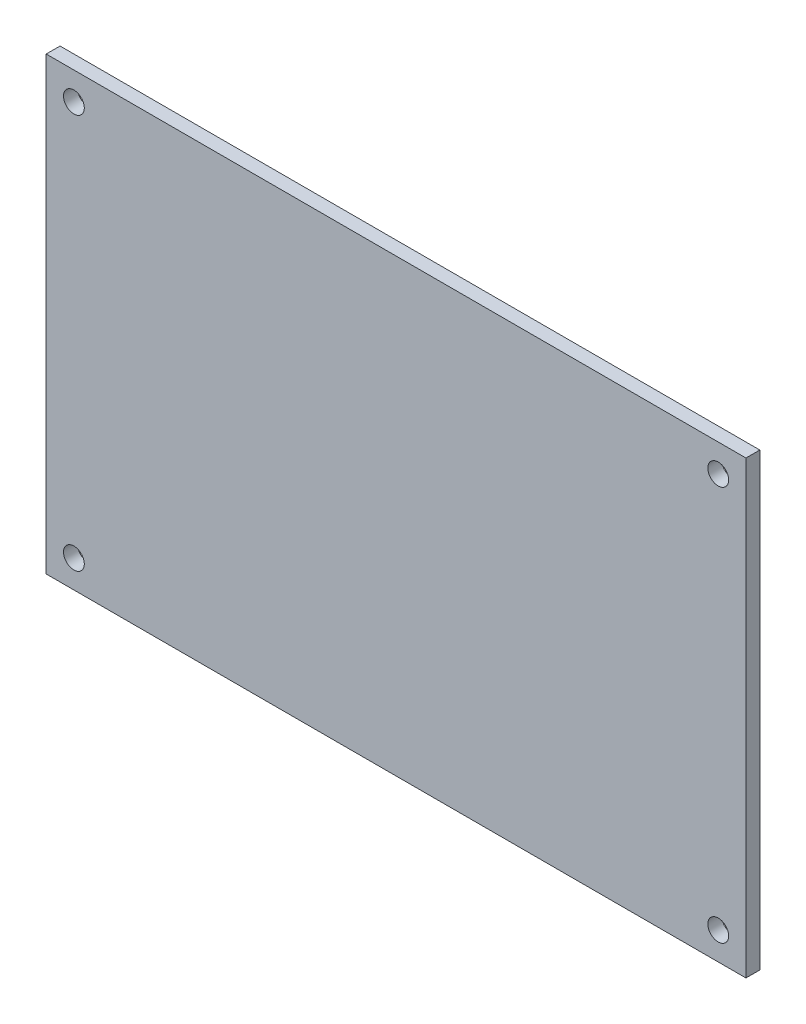
ISO-10303-21;
HEADER;
FILE_DESCRIPTION(('STEP AP214'),'2;1');
FILE_NAME('part.step','',(''),(''),'','','');
FILE_SCHEMA(('AUTOMOTIVE_DESIGN { 1 0 10303 214 1 1 1 1 }'));
ENDSEC;
DATA;
#1=APPLICATION_CONTEXT('core data for automotive mechanical design processes');
#2=APPLICATION_PROTOCOL_DEFINITION('international standard','automotive_design',2000,#1);
#3=PRODUCT_CONTEXT('',#1,'mechanical');
#4=PRODUCT('Part','Part','',(#3));
#5=PRODUCT_RELATED_PRODUCT_CATEGORY('part','',(#4));
#6=PRODUCT_DEFINITION_FORMATION('','',#4);
#7=PRODUCT_DEFINITION_CONTEXT('part definition',#1,'design');
#8=PRODUCT_DEFINITION('design','',#6,#7);
#9=PRODUCT_DEFINITION_SHAPE('','',#8);
#10=(LENGTH_UNIT() NAMED_UNIT(*) SI_UNIT(.MILLI.,.METRE.));
#11=(NAMED_UNIT(*) PLANE_ANGLE_UNIT() SI_UNIT($,.RADIAN.));
#12=(NAMED_UNIT(*) SI_UNIT($,.STERADIAN.) SOLID_ANGLE_UNIT());
#13=UNCERTAINTY_MEASURE_WITH_UNIT(LENGTH_MEASURE(1.E-05),#10,'distance_accuracy_value','');
#14=(GEOMETRIC_REPRESENTATION_CONTEXT(3) GLOBAL_UNCERTAINTY_ASSIGNED_CONTEXT((#13)) GLOBAL_UNIT_ASSIGNED_CONTEXT((#10,
#11,#12)) REPRESENTATION_CONTEXT('',''));
#15=CARTESIAN_POINT('',(0.,0.,0.));
#16=DIRECTION('',(0.,0.,1.));
#17=DIRECTION('',(1.,0.,0.));
#18=AXIS2_PLACEMENT_3D('',#15,#16,#17);
#19=CARTESIAN_POINT('',(0.,0.,2.));
#20=DIRECTION('',(1.,0.,0.));
#21=DIRECTION('',(0.,0.,-1.));
#22=AXIS2_PLACEMENT_3D('',#19,#20,#21);
#23=PLANE('',#22);
#24=DIRECTION('',(0.,-1.,0.));
#25=VECTOR('',#24,1.);
#26=CARTESIAN_POINT('',(0.,0.,0.));
#27=LINE('',#26,#25);
#28=CARTESIAN_POINT('',(0.,65.,0.));
#29=VERTEX_POINT('',#28);
#30=CARTESIAN_POINT('',(0.,0.,0.));
#31=VERTEX_POINT('',#30);
#32=EDGE_CURVE('E106',#29,#31,#27,.T.);
#33=ORIENTED_EDGE('',*,*,#32,.T.);
#34=DIRECTION('',(0.,0.,-1.));
#35=VECTOR('',#34,1.);
#36=CARTESIAN_POINT('',(0.,0.,2.));
#37=LINE('',#36,#35);
#38=CARTESIAN_POINT('',(0.,0.,2.));
#39=VERTEX_POINT('',#38);
#40=EDGE_CURVE('E11',#39,#31,#37,.T.);
#41=ORIENTED_EDGE('',*,*,#40,.F.);
#42=DIRECTION('',(0.,-1.,0.));
#43=VECTOR('',#42,1.);
#44=CARTESIAN_POINT('',(0.,0.,2.));
#45=LINE('',#44,#43);
#46=CARTESIAN_POINT('',(0.,65.,2.));
#47=VERTEX_POINT('',#46);
#48=EDGE_CURVE('E90',#47,#39,#45,.T.);
#49=ORIENTED_EDGE('',*,*,#48,.F.);
#50=DIRECTION('',(0.,0.,-1.));
#51=VECTOR('',#50,1.);
#52=CARTESIAN_POINT('',(0.,65.,2.));
#53=LINE('',#52,#51);
#54=EDGE_CURVE('E102',#47,#29,#53,.T.);
#55=ORIENTED_EDGE('',*,*,#54,.T.);
#56=EDGE_LOOP('',(#33,#41,#49,#55));
#57=FACE_BOUND('',#56,.T.);
#58=ADVANCED_FACE('F38',(#57),#23,.F.);
#59=CARTESIAN_POINT('',(0.,0.,2.));
#60=DIRECTION('',(0.,1.,0.));
#61=DIRECTION('',(0.,0.,1.));
#62=AXIS2_PLACEMENT_3D('',#59,#60,#61);
#63=PLANE('',#62);
#64=DIRECTION('',(1.,0.,0.));
#65=VECTOR('',#64,1.);
#66=CARTESIAN_POINT('',(0.,0.,0.));
#67=LINE('',#66,#65);
#68=CARTESIAN_POINT('',(101.,0.,0.));
#69=VERTEX_POINT('',#68);
#70=EDGE_CURVE('E95',#31,#69,#67,.T.);
#71=ORIENTED_EDGE('',*,*,#70,.T.);
#72=DIRECTION('',(0.,0.,-1.));
#73=VECTOR('',#72,1.);
#74=CARTESIAN_POINT('',(101.,0.,2.));
#75=LINE('',#74,#73);
#76=CARTESIAN_POINT('',(101.,0.,2.));
#77=VERTEX_POINT('',#76);
#78=EDGE_CURVE('E47',#77,#69,#75,.T.);
#79=ORIENTED_EDGE('',*,*,#78,.F.);
#80=DIRECTION('',(1.,0.,0.));
#81=VECTOR('',#80,1.);
#82=CARTESIAN_POINT('',(0.,0.,2.));
#83=LINE('',#82,#81);
#84=EDGE_CURVE('E85',#39,#77,#83,.T.);
#85=ORIENTED_EDGE('',*,*,#84,.F.);
#86=ORIENTED_EDGE('',*,*,#40,.T.);
#87=EDGE_LOOP('',(#71,#79,#85,#86));
#88=FACE_BOUND('',#87,.T.);
#89=ADVANCED_FACE('F94',(#88),#63,.F.);
#90=CARTESIAN_POINT('',(101.,0.,2.));
#91=DIRECTION('',(-1.,0.,0.));
#92=DIRECTION('',(0.,0.,1.));
#93=AXIS2_PLACEMENT_3D('',#90,#91,#92);
#94=PLANE('',#93);
#95=DIRECTION('',(0.,1.,0.));
#96=VECTOR('',#95,1.);
#97=CARTESIAN_POINT('',(101.,0.,0.));
#98=LINE('',#97,#96);
#99=CARTESIAN_POINT('',(101.,65.,0.));
#100=VERTEX_POINT('',#99);
#101=EDGE_CURVE('E72',#69,#100,#98,.T.);
#102=ORIENTED_EDGE('',*,*,#101,.T.);
#103=DIRECTION('',(0.,0.,-1.));
#104=VECTOR('',#103,1.);
#105=CARTESIAN_POINT('',(101.,65.,2.));
#106=LINE('',#105,#104);
#107=CARTESIAN_POINT('',(101.,65.,2.));
#108=VERTEX_POINT('',#107);
#109=EDGE_CURVE('E97',#108,#100,#106,.T.);
#110=ORIENTED_EDGE('',*,*,#109,.F.);
#111=DIRECTION('',(0.,1.,0.));
#112=VECTOR('',#111,1.);
#113=CARTESIAN_POINT('',(101.,0.,2.));
#114=LINE('',#113,#112);
#115=EDGE_CURVE('E88',#77,#108,#114,.T.);
#116=ORIENTED_EDGE('',*,*,#115,.F.);
#117=ORIENTED_EDGE('',*,*,#78,.T.);
#118=EDGE_LOOP('',(#102,#110,#116,#117));
#119=FACE_BOUND('',#118,.T.);
#120=ADVANCED_FACE('F98',(#119),#94,.F.);
#121=CARTESIAN_POINT('',(0.,65.,2.));
#122=DIRECTION('',(0.,-1.,0.));
#123=DIRECTION('',(0.,0.,-1.));
#124=AXIS2_PLACEMENT_3D('',#121,#122,#123);
#125=PLANE('',#124);
#126=DIRECTION('',(-1.,0.,0.));
#127=VECTOR('',#126,1.);
#128=CARTESIAN_POINT('',(0.,65.,0.));
#129=LINE('',#128,#127);
#130=EDGE_CURVE('E78',#100,#29,#129,.T.);
#131=ORIENTED_EDGE('',*,*,#130,.T.);
#132=ORIENTED_EDGE('',*,*,#54,.F.);
#133=DIRECTION('',(-1.,0.,0.));
#134=VECTOR('',#133,1.);
#135=CARTESIAN_POINT('',(0.,65.,2.));
#136=LINE('',#135,#134);
#137=EDGE_CURVE('E55',#108,#47,#136,.T.);
#138=ORIENTED_EDGE('',*,*,#137,.F.);
#139=ORIENTED_EDGE('',*,*,#109,.T.);
#140=EDGE_LOOP('',(#131,#132,#138,#139));
#141=FACE_BOUND('',#140,.T.);
#142=ADVANCED_FACE('F120',(#141),#125,.F.);
#143=CARTESIAN_POINT('',(0.,0.,2.));
#144=DIRECTION('',(0.,0.,-1.));
#145=DIRECTION('',(-1.,0.,0.));
#146=AXIS2_PLACEMENT_3D('',#143,#144,#145);
#147=PLANE('',#146);
#148=CARTESIAN_POINT('',(4.,4.,2.));
#149=DIRECTION('',(0.,0.,1.));
#150=DIRECTION('',(1.,0.,0.));
#151=AXIS2_PLACEMENT_3D('',#148,#149,#150);
#152=CIRCLE('',#151,1.5);
#153=CARTESIAN_POINT('',(5.5,4.,2.));
#154=VERTEX_POINT('',#153);
#155=EDGE_CURVE('E135',#154,#154,#152,.T.);
#156=ORIENTED_EDGE('',*,*,#155,.F.);
#157=EDGE_LOOP('',(#156));
#158=FACE_BOUND('',#157,.T.);
#159=CARTESIAN_POINT('',(97.,4.,2.));
#160=DIRECTION('',(0.,0.,1.));
#161=DIRECTION('',(1.,0.,0.));
#162=AXIS2_PLACEMENT_3D('',#159,#160,#161);
#163=CIRCLE('',#162,1.5);
#164=CARTESIAN_POINT('',(98.5,4.,2.));
#165=VERTEX_POINT('',#164);
#166=EDGE_CURVE('E143',#165,#165,#163,.T.);
#167=ORIENTED_EDGE('',*,*,#166,.F.);
#168=EDGE_LOOP('',(#167));
#169=FACE_BOUND('',#168,.T.);
#170=CARTESIAN_POINT('',(97.,61.,2.));
#171=DIRECTION('',(0.,0.,1.));
#172=DIRECTION('',(1.,0.,0.));
#173=AXIS2_PLACEMENT_3D('',#170,#171,#172);
#174=CIRCLE('',#173,1.50000000000001);
#175=CARTESIAN_POINT('',(98.5,61.,2.));
#176=VERTEX_POINT('',#175);
#177=EDGE_CURVE('E151',#176,#176,#174,.T.);
#178=ORIENTED_EDGE('',*,*,#177,.F.);
#179=EDGE_LOOP('',(#178));
#180=FACE_BOUND('',#179,.T.);
#181=CARTESIAN_POINT('',(4.,61.,2.));
#182=DIRECTION('',(0.,0.,1.));
#183=DIRECTION('',(1.,0.,0.));
#184=AXIS2_PLACEMENT_3D('',#181,#182,#183);
#185=CIRCLE('',#184,1.5);
#186=CARTESIAN_POINT('',(5.5,61.,2.));
#187=VERTEX_POINT('',#186);
#188=EDGE_CURVE('E127',#187,#187,#185,.T.);
#189=ORIENTED_EDGE('',*,*,#188,.F.);
#190=EDGE_LOOP('',(#189));
#191=FACE_BOUND('',#190,.T.);
#192=ORIENTED_EDGE('',*,*,#48,.T.);
#193=ORIENTED_EDGE('',*,*,#84,.T.);
#194=ORIENTED_EDGE('',*,*,#115,.T.);
#195=ORIENTED_EDGE('',*,*,#137,.T.);
#196=EDGE_LOOP('',(#192,#193,#194,#195));
#197=FACE_BOUND('',#196,.T.);
#198=ADVANCED_FACE('F86',(#158,#169,#180,#191,#197),#147,.F.);
#199=CARTESIAN_POINT('',(0.,0.,0.));
#200=DIRECTION('',(0.,0.,-1.));
#201=DIRECTION('',(-1.,0.,0.));
#202=AXIS2_PLACEMENT_3D('',#199,#200,#201);
#203=PLANE('',#202);
#204=CARTESIAN_POINT('',(4.,4.,0.));
#205=DIRECTION('',(0.,0.,1.));
#206=DIRECTION('',(1.,0.,0.));
#207=AXIS2_PLACEMENT_3D('',#204,#205,#206);
#208=CIRCLE('',#207,1.5);
#209=CARTESIAN_POINT('',(5.5,4.,0.));
#210=VERTEX_POINT('',#209);
#211=EDGE_CURVE('E139',#210,#210,#208,.T.);
#212=ORIENTED_EDGE('',*,*,#211,.T.);
#213=EDGE_LOOP('',(#212));
#214=FACE_BOUND('',#213,.T.);
#215=CARTESIAN_POINT('',(97.,4.,0.));
#216=DIRECTION('',(0.,0.,1.));
#217=DIRECTION('',(1.,0.,0.));
#218=AXIS2_PLACEMENT_3D('',#215,#216,#217);
#219=CIRCLE('',#218,1.5);
#220=CARTESIAN_POINT('',(98.5,4.,0.));
#221=VERTEX_POINT('',#220);
#222=EDGE_CURVE('E147',#221,#221,#219,.T.);
#223=ORIENTED_EDGE('',*,*,#222,.T.);
#224=EDGE_LOOP('',(#223));
#225=FACE_BOUND('',#224,.T.);
#226=CARTESIAN_POINT('',(97.,61.,0.));
#227=DIRECTION('',(0.,0.,1.));
#228=DIRECTION('',(1.,0.,0.));
#229=AXIS2_PLACEMENT_3D('',#226,#227,#228);
#230=CIRCLE('',#229,1.50000000000001);
#231=CARTESIAN_POINT('',(98.5,61.,0.));
#232=VERTEX_POINT('',#231);
#233=EDGE_CURVE('E131',#232,#232,#230,.T.);
#234=ORIENTED_EDGE('',*,*,#233,.T.);
#235=EDGE_LOOP('',(#234));
#236=FACE_BOUND('',#235,.T.);
#237=CARTESIAN_POINT('',(4.,61.,0.));
#238=DIRECTION('',(0.,0.,1.));
#239=DIRECTION('',(1.,0.,0.));
#240=AXIS2_PLACEMENT_3D('',#237,#238,#239);
#241=CIRCLE('',#240,1.5);
#242=CARTESIAN_POINT('',(5.5,61.,0.));
#243=VERTEX_POINT('',#242);
#244=EDGE_CURVE('E110',#243,#243,#241,.T.);
#245=ORIENTED_EDGE('',*,*,#244,.T.);
#246=EDGE_LOOP('',(#245));
#247=FACE_BOUND('',#246,.T.);
#248=ORIENTED_EDGE('',*,*,#32,.F.);
#249=ORIENTED_EDGE('',*,*,#130,.F.);
#250=ORIENTED_EDGE('',*,*,#101,.F.);
#251=ORIENTED_EDGE('',*,*,#70,.F.);
#252=EDGE_LOOP('',(#248,#249,#250,#251));
#253=FACE_BOUND('',#252,.T.);
#254=ADVANCED_FACE('F123',(#214,#225,#236,#247,#253),#203,.T.);
#255=CARTESIAN_POINT('',(4.,61.,0.));
#256=DIRECTION('',(0.,0.,1.));
#257=DIRECTION('',(1.,0.,0.));
#258=AXIS2_PLACEMENT_3D('',#255,#256,#257);
#259=CYLINDRICAL_SURFACE('',#258,1.5);
#260=ORIENTED_EDGE('',*,*,#244,.F.);
#261=EDGE_LOOP('',(#260));
#262=FACE_BOUND('',#261,.T.);
#263=ORIENTED_EDGE('',*,*,#188,.T.);
#264=EDGE_LOOP('',(#263));
#265=FACE_BOUND('',#264,.T.);
#266=ADVANCED_FACE('F165',(#262,#265),#259,.F.);
#267=CARTESIAN_POINT('',(97.,61.,0.));
#268=DIRECTION('',(0.,0.,1.));
#269=DIRECTION('',(1.,0.,0.));
#270=AXIS2_PLACEMENT_3D('',#267,#268,#269);
#271=CYLINDRICAL_SURFACE('',#270,1.50000000000001);
#272=ORIENTED_EDGE('',*,*,#233,.F.);
#273=EDGE_LOOP('',(#272));
#274=FACE_BOUND('',#273,.T.);
#275=ORIENTED_EDGE('',*,*,#177,.T.);
#276=EDGE_LOOP('',(#275));
#277=FACE_BOUND('',#276,.T.);
#278=ADVANCED_FACE('F161',(#274,#277),#271,.F.);
#279=CARTESIAN_POINT('',(97.,4.,0.));
#280=DIRECTION('',(0.,0.,1.));
#281=DIRECTION('',(1.,0.,0.));
#282=AXIS2_PLACEMENT_3D('',#279,#280,#281);
#283=CYLINDRICAL_SURFACE('',#282,1.5);
#284=ORIENTED_EDGE('',*,*,#222,.F.);
#285=EDGE_LOOP('',(#284));
#286=FACE_BOUND('',#285,.T.);
#287=ORIENTED_EDGE('',*,*,#166,.T.);
#288=EDGE_LOOP('',(#287));
#289=FACE_BOUND('',#288,.T.);
#290=ADVANCED_FACE('F164',(#286,#289),#283,.F.);
#291=CARTESIAN_POINT('',(4.,4.,0.));
#292=DIRECTION('',(0.,0.,1.));
#293=DIRECTION('',(1.,0.,0.));
#294=AXIS2_PLACEMENT_3D('',#291,#292,#293);
#295=CYLINDRICAL_SURFACE('',#294,1.5);
#296=ORIENTED_EDGE('',*,*,#211,.F.);
#297=EDGE_LOOP('',(#296));
#298=FACE_BOUND('',#297,.T.);
#299=ORIENTED_EDGE('',*,*,#155,.T.);
#300=EDGE_LOOP('',(#299));
#301=FACE_BOUND('',#300,.T.);
#302=ADVANCED_FACE('F226',(#298,#301),#295,.F.);
#303=CLOSED_SHELL('',(#58,#89,#120,#142,#198,#254,#266,#278,#290,#302));
#304=MANIFOLD_SOLID_BREP('B2',#303);
#305=ADVANCED_BREP_SHAPE_REPRESENTATION('',(#18,#304),#14);
#306=SHAPE_DEFINITION_REPRESENTATION(#9,#305);
ENDSEC;
END-ISO-10303-21;
